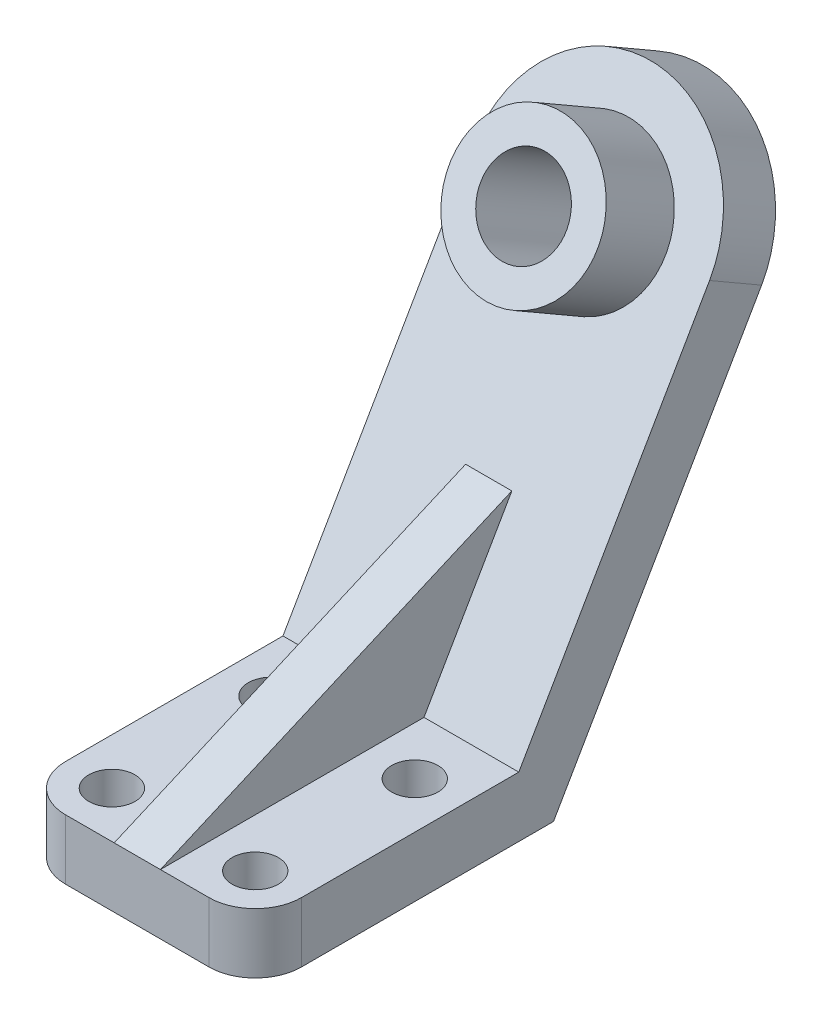
ISO-10303-21;
HEADER;
FILE_DESCRIPTION(('STEP AP214'),'2;1');
FILE_NAME('part.step','',(''),(''),'','','');
FILE_SCHEMA(('AUTOMOTIVE_DESIGN { 1 0 10303 214 1 1 1 1 }'));
ENDSEC;
DATA;
#1=APPLICATION_CONTEXT('core data for automotive mechanical design processes');
#2=APPLICATION_PROTOCOL_DEFINITION('international standard','automotive_design',2000,#1);
#3=PRODUCT_CONTEXT('',#1,'mechanical');
#4=PRODUCT('Part','Part','',(#3));
#5=PRODUCT_RELATED_PRODUCT_CATEGORY('part','',(#4));
#6=PRODUCT_DEFINITION_FORMATION('','',#4);
#7=PRODUCT_DEFINITION_CONTEXT('part definition',#1,'design');
#8=PRODUCT_DEFINITION('design','',#6,#7);
#9=PRODUCT_DEFINITION_SHAPE('','',#8);
#10=(LENGTH_UNIT() NAMED_UNIT(*) SI_UNIT(.MILLI.,.METRE.));
#11=(NAMED_UNIT(*) PLANE_ANGLE_UNIT() SI_UNIT($,.RADIAN.));
#12=(NAMED_UNIT(*) SI_UNIT($,.STERADIAN.) SOLID_ANGLE_UNIT());
#13=UNCERTAINTY_MEASURE_WITH_UNIT(LENGTH_MEASURE(1.E-05),#10,'distance_accuracy_value','');
#14=(GEOMETRIC_REPRESENTATION_CONTEXT(3) GLOBAL_UNCERTAINTY_ASSIGNED_CONTEXT((#13)) GLOBAL_UNIT_ASSIGNED_CONTEXT((#10,
#11,#12)) REPRESENTATION_CONTEXT('',''));
#15=CARTESIAN_POINT('',(0.,0.,0.));
#16=DIRECTION('',(0.,0.,1.));
#17=DIRECTION('',(1.,0.,0.));
#18=AXIS2_PLACEMENT_3D('',#15,#16,#17);
#19=CARTESIAN_POINT('',(51.,26.,0.));
#20=DIRECTION('',(0.,1.,0.));
#21=DIRECTION('',(0.,0.,1.));
#22=AXIS2_PLACEMENT_3D('',#19,#20,#21);
#23=PLANE('',#22);
#24=CARTESIAN_POINT('',(-31.0000000000002,26.,-88.9999999999996));
#25=DIRECTION('',(0.,1.,0.));
#26=DIRECTION('',(0.,0.,1.));
#27=AXIS2_PLACEMENT_3D('',#24,#25,#26);
#28=CIRCLE('',#27,10.);
#29=CARTESIAN_POINT('',(-31.0000000000002,26.,-78.9999999999996));
#30=VERTEX_POINT('',#29);
#31=EDGE_CURVE('E315',#30,#30,#28,.T.);
#32=ORIENTED_EDGE('',*,*,#31,.F.);
#33=EDGE_LOOP('',(#32));
#34=FACE_BOUND('',#33,.T.);
#35=CARTESIAN_POINT('',(-31.,26.,-19.9999999999996));
#36=DIRECTION('',(0.,1.,0.));
#37=DIRECTION('',(0.,0.,1.));
#38=AXIS2_PLACEMENT_3D('',#35,#36,#37);
#39=CIRCLE('',#38,10.);
#40=CARTESIAN_POINT('',(-31.,26.,-9.99999999999957));
#41=VERTEX_POINT('',#40);
#42=EDGE_CURVE('E323',#41,#41,#39,.T.);
#43=ORIENTED_EDGE('',*,*,#42,.F.);
#44=EDGE_LOOP('',(#43));
#45=FACE_BOUND('',#44,.T.);
#46=DIRECTION('',(0.,0.,-1.));
#47=VECTOR('',#46,1.);
#48=CARTESIAN_POINT('',(-51.,26.,0.));
#49=LINE('',#48,#47);
#50=CARTESIAN_POINT('',(-51.,26.,-20.));
#51=VERTEX_POINT('',#50);
#52=CARTESIAN_POINT('',(-51.,26.,-113.98889300107));
#53=VERTEX_POINT('',#52);
#54=EDGE_CURVE('E228',#51,#53,#49,.T.);
#55=ORIENTED_EDGE('',*,*,#54,.F.);
#56=CARTESIAN_POINT('',(-31.,26.,-20.));
#57=DIRECTION('',(0.,1.,0.));
#58=DIRECTION('',(0.,0.,1.));
#59=AXIS2_PLACEMENT_3D('',#56,#57,#58);
#60=CIRCLE('',#59,20.);
#61=CARTESIAN_POINT('',(-31.,26.,0.));
#62=VERTEX_POINT('',#61);
#63=EDGE_CURVE('E190',#51,#62,#60,.T.);
#64=ORIENTED_EDGE('',*,*,#63,.T.);
#65=DIRECTION('',(-1.,0.,0.));
#66=VECTOR('',#65,1.);
#67=CARTESIAN_POINT('',(51.,26.,0.));
#68=LINE('',#67,#66);
#69=CARTESIAN_POINT('',(-10.,26.,0.));
#70=VERTEX_POINT('',#69);
#71=EDGE_CURVE('E235',#70,#62,#68,.T.);
#72=ORIENTED_EDGE('',*,*,#71,.F.);
#73=DIRECTION('',(0.,0.,-1.));
#74=VECTOR('',#73,1.);
#75=CARTESIAN_POINT('',(-10.,26.,-113.98889300107));
#76=LINE('',#75,#74);
#77=CARTESIAN_POINT('',(-10.,26.,-113.98889300107));
#78=VERTEX_POINT('',#77);
#79=EDGE_CURVE('E293',#70,#78,#76,.T.);
#80=ORIENTED_EDGE('',*,*,#79,.T.);
#81=DIRECTION('',(-1.,0.,0.));
#82=VECTOR('',#81,1.);
#83=CARTESIAN_POINT('',(51.,26.,-113.98889300107));
#84=LINE('',#83,#82);
#85=EDGE_CURVE('E166',#78,#53,#84,.T.);
#86=ORIENTED_EDGE('',*,*,#85,.T.);
#87=EDGE_LOOP('',(#55,#64,#72,#80,#86));
#88=FACE_BOUND('',#87,.T.);
#89=ADVANCED_FACE('F58',(#34,#45,#88),#23,.T.);
#90=CARTESIAN_POINT('',(51.,-55.8586385440961,-96.7500000000003));
#91=DIRECTION('',(0.,0.499999999999998,0.86602540378444));
#92=DIRECTION('',(0.,-0.86602540378444,0.499999999999998));
#93=AXIS2_PLACEMENT_3D('',#90,#91,#92);
#94=PLANE('',#93);
#95=CARTESIAN_POINT('',(0.,155.884572680915,-218.999999999836));
#96=DIRECTION('',(0.,0.499999999999998,0.86602540378444));
#97=DIRECTION('',(0.,-0.86602540378444,0.499999999999998));
#98=AXIS2_PLACEMENT_3D('',#95,#96,#97);
#99=CIRCLE('',#98,18.5);
#100=CARTESIAN_POINT('',(0.,139.863102710903,-209.749999999836));
#101=VERTEX_POINT('',#100);
#102=EDGE_CURVE('E275',#101,#101,#99,.T.);
#103=ORIENTED_EDGE('',*,*,#102,.T.);
#104=EDGE_LOOP('',(#103));
#105=FACE_BOUND('',#104,.T.);
#106=CARTESIAN_POINT('',(0.,155.884572681199,-219.));
#107=DIRECTION('',(0.,0.499999999999998,0.86602540378444));
#108=DIRECTION('',(0.,-0.86602540378444,0.499999999999998));
#109=AXIS2_PLACEMENT_3D('',#106,#107,#108);
#110=CIRCLE('',#109,51.);
#111=CARTESIAN_POINT('',(51.,155.884572681199,-219.));
#112=VERTEX_POINT('',#111);
#113=CARTESIAN_POINT('',(-51.,155.884572681199,-219.));
#114=VERTEX_POINT('',#113);
#115=EDGE_CURVE('E256',#112,#114,#110,.T.);
#116=ORIENTED_EDGE('',*,*,#115,.F.);
#117=DIRECTION('',(0.,0.86602540378444,-0.499999999999998));
#118=VECTOR('',#117,1.);
#119=CARTESIAN_POINT('',(51.,-55.8586385440961,-96.7500000000003));
#120=LINE('',#119,#118);
#121=CARTESIAN_POINT('',(51.,0.,-129.));
#122=VERTEX_POINT('',#121);
#123=EDGE_CURVE('E227',#122,#112,#120,.T.);
#124=ORIENTED_EDGE('',*,*,#123,.F.);
#125=DIRECTION('',(-1.,0.,0.));
#126=VECTOR('',#125,1.);
#127=CARTESIAN_POINT('',(51.,0.,-129.));
#128=LINE('',#127,#126);
#129=CARTESIAN_POINT('',(-51.,0.,-129.));
#130=VERTEX_POINT('',#129);
#131=EDGE_CURVE('E243',#122,#130,#128,.T.);
#132=ORIENTED_EDGE('',*,*,#131,.T.);
#133=DIRECTION('',(0.,0.86602540378444,-0.499999999999998));
#134=VECTOR('',#133,1.);
#135=CARTESIAN_POINT('',(-51.,-55.8586385440961,-96.7500000000003));
#136=LINE('',#135,#134);
#137=EDGE_CURVE('E225',#130,#114,#136,.T.);
#138=ORIENTED_EDGE('',*,*,#137,.T.);
#139=EDGE_LOOP('',(#116,#124,#132,#138));
#140=FACE_BOUND('',#139,.T.);
#141=ADVANCED_FACE('F342',(#105,#140),#94,.F.);
#142=CARTESIAN_POINT('',(51.,-42.8586385440962,-74.2333395016049));
#143=DIRECTION('',(0.,0.499999999999998,0.86602540378444));
#144=DIRECTION('',(0.,-0.86602540378444,0.499999999999998));
#145=AXIS2_PLACEMENT_3D('',#142,#143,#144);
#146=PLANE('',#145);
#147=DIRECTION('',(0.,0.866025403784438,-0.500000000000001));
#148=VECTOR('',#147,1.);
#149=CARTESIAN_POINT('',(10.,91.8179306876173,-151.98889300107));
#150=LINE('',#149,#148);
#151=CARTESIAN_POINT('',(10.,26.,-113.98889300107));
#152=VERTEX_POINT('',#151);
#153=CARTESIAN_POINT('',(10.,91.8179306876173,-151.98889300107));
#154=VERTEX_POINT('',#153);
#155=EDGE_CURVE('E142',#152,#154,#150,.T.);
#156=ORIENTED_EDGE('',*,*,#155,.F.);
#157=CARTESIAN_POINT('',(51.,26.,-113.98889300107));
#158=VERTEX_POINT('',#157);
#159=EDGE_CURVE('E156',#158,#152,#84,.T.);
#160=ORIENTED_EDGE('',*,*,#159,.F.);
#161=DIRECTION('',(0.,0.86602540378444,-0.499999999999998));
#162=VECTOR('',#161,1.);
#163=CARTESIAN_POINT('',(51.,-42.8586385440962,-74.2333395016049));
#164=LINE('',#163,#162);
#165=CARTESIAN_POINT('',(51.,168.884572681199,-196.483339501604));
#166=VERTEX_POINT('',#165);
#167=EDGE_CURVE('E261',#158,#166,#164,.T.);
#168=ORIENTED_EDGE('',*,*,#167,.T.);
#169=CARTESIAN_POINT('',(0.,168.884572681199,-196.483339501604));
#170=DIRECTION('',(0.,0.499999999999998,0.86602540378444));
#171=DIRECTION('',(0.,-0.86602540378444,0.499999999999998));
#172=AXIS2_PLACEMENT_3D('',#169,#170,#171);
#173=CIRCLE('',#172,51.);
#174=CARTESIAN_POINT('',(-51.,168.884572681199,-196.483339501604));
#175=VERTEX_POINT('',#174);
#176=EDGE_CURVE('E185',#166,#175,#173,.T.);
#177=ORIENTED_EDGE('',*,*,#176,.T.);
#178=DIRECTION('',(0.,0.86602540378444,-0.499999999999998));
#179=VECTOR('',#178,1.);
#180=CARTESIAN_POINT('',(-51.,-42.8586385440962,-74.2333395016049));
#181=LINE('',#180,#179);
#182=EDGE_CURVE('E250',#53,#175,#181,.T.);
#183=ORIENTED_EDGE('',*,*,#182,.F.);
#184=ORIENTED_EDGE('',*,*,#85,.F.);
#185=DIRECTION('',(0.,0.866025403784438,-0.500000000000001));
#186=VECTOR('',#185,1.);
#187=CARTESIAN_POINT('',(-10.,91.8179306876173,-151.98889300107));
#188=LINE('',#187,#186);
#189=CARTESIAN_POINT('',(-10.,91.8179306876173,-151.98889300107));
#190=VERTEX_POINT('',#189);
#191=EDGE_CURVE('E290',#78,#190,#188,.T.);
#192=ORIENTED_EDGE('',*,*,#191,.T.);
#193=DIRECTION('',(-1.,0.,0.));
#194=VECTOR('',#193,1.);
#195=CARTESIAN_POINT('',(10.,91.8179306876173,-151.98889300107));
#196=LINE('',#195,#194);
#197=EDGE_CURVE('E159',#154,#190,#196,.T.);
#198=ORIENTED_EDGE('',*,*,#197,.F.);
#199=EDGE_LOOP('',(#156,#160,#168,#177,#183,#184,#192,#198));
#200=FACE_BOUND('',#199,.T.);
#201=CARTESIAN_POINT('',(0.,168.884572680915,-196.48333950144));
#202=DIRECTION('',(0.,0.499999999999998,0.86602540378444));
#203=DIRECTION('',(0.,-0.86602540378444,0.499999999999998));
#204=AXIS2_PLACEMENT_3D('',#201,#202,#203);
#205=CIRCLE('',#204,32.);
#206=CARTESIAN_POINT('',(0.,141.171759759813,-180.48333950144));
#207=VERTEX_POINT('',#206);
#208=EDGE_CURVE('E181',#207,#207,#205,.F.);
#209=ORIENTED_EDGE('',*,*,#208,.T.);
#210=EDGE_LOOP('',(#209));
#211=FACE_BOUND('',#210,.T.);
#212=ADVANCED_FACE('F153',(#200,#211),#146,.T.);
#213=CARTESIAN_POINT('',(51.,0.,0.));
#214=DIRECTION('',(1.,0.,0.));
#215=DIRECTION('',(0.,0.,-1.));
#216=AXIS2_PLACEMENT_3D('',#213,#214,#215);
#217=PLANE('',#216);
#218=DIRECTION('',(0.,0.,-1.));
#219=VECTOR('',#218,1.);
#220=CARTESIAN_POINT('',(51.,26.,0.));
#221=LINE('',#220,#219);
#222=CARTESIAN_POINT('',(51.,26.,-20.));
#223=VERTEX_POINT('',#222);
#224=EDGE_CURVE('E163',#223,#158,#221,.T.);
#225=ORIENTED_EDGE('',*,*,#224,.F.);
#226=DIRECTION('',(0.,1.,0.));
#227=VECTOR('',#226,1.);
#228=CARTESIAN_POINT('',(51.,0.,-20.));
#229=LINE('',#228,#227);
#230=CARTESIAN_POINT('',(51.,0.,-20.));
#231=VERTEX_POINT('',#230);
#232=EDGE_CURVE('E12',#223,#231,#229,.F.);
#233=ORIENTED_EDGE('',*,*,#232,.T.);
#234=DIRECTION('',(0.,0.,-1.));
#235=VECTOR('',#234,1.);
#236=CARTESIAN_POINT('',(51.,0.,0.));
#237=LINE('',#236,#235);
#238=EDGE_CURVE('E245',#231,#122,#237,.T.);
#239=ORIENTED_EDGE('',*,*,#238,.T.);
#240=ORIENTED_EDGE('',*,*,#123,.T.);
#241=DIRECTION('',(0.,0.499999999999998,0.86602540378444));
#242=VECTOR('',#241,1.);
#243=CARTESIAN_POINT('',(51.,117.884572681199,-284.817930687617));
#244=LINE('',#243,#242);
#245=EDGE_CURVE('E170',#112,#166,#244,.T.);
#246=ORIENTED_EDGE('',*,*,#245,.T.);
#247=ORIENTED_EDGE('',*,*,#167,.F.);
#248=EDGE_LOOP('',(#225,#233,#239,#240,#246,#247));
#249=FACE_BOUND('',#248,.T.);
#250=ADVANCED_FACE('F361',(#249),#217,.T.);
#251=CARTESIAN_POINT('',(-51.,0.,0.));
#252=DIRECTION('',(1.,0.,0.));
#253=DIRECTION('',(0.,0.,-1.));
#254=AXIS2_PLACEMENT_3D('',#251,#252,#253);
#255=PLANE('',#254);
#256=DIRECTION('',(0.,0.,-1.));
#257=VECTOR('',#256,1.);
#258=CARTESIAN_POINT('',(-51.,0.,0.));
#259=LINE('',#258,#257);
#260=CARTESIAN_POINT('',(-51.,0.,-20.));
#261=VERTEX_POINT('',#260);
#262=EDGE_CURVE('E212',#261,#130,#259,.T.);
#263=ORIENTED_EDGE('',*,*,#262,.F.);
#264=DIRECTION('',(0.,1.,0.));
#265=VECTOR('',#264,1.);
#266=CARTESIAN_POINT('',(-51.,26.,-20.));
#267=LINE('',#266,#265);
#268=EDGE_CURVE('E180',#261,#51,#267,.T.);
#269=ORIENTED_EDGE('',*,*,#268,.T.);
#270=ORIENTED_EDGE('',*,*,#54,.T.);
#271=ORIENTED_EDGE('',*,*,#182,.T.);
#272=DIRECTION('',(0.,0.499999999999998,0.86602540378444));
#273=VECTOR('',#272,1.);
#274=CARTESIAN_POINT('',(-51.,117.884572681199,-284.817930687617));
#275=LINE('',#274,#273);
#276=EDGE_CURVE('E165',#114,#175,#275,.T.);
#277=ORIENTED_EDGE('',*,*,#276,.F.);
#278=ORIENTED_EDGE('',*,*,#137,.F.);
#279=EDGE_LOOP('',(#263,#269,#270,#271,#277,#278));
#280=FACE_BOUND('',#279,.T.);
#281=ADVANCED_FACE('F221',(#280),#255,.F.);
#282=CARTESIAN_POINT('',(30.9999999999998,26.,-89.));
#283=DIRECTION('',(0.,1.,0.));
#284=DIRECTION('',(0.,0.,1.));
#285=AXIS2_PLACEMENT_3D('',#282,#283,#284);
#286=CIRCLE('',#285,9.99999999999999);
#287=CARTESIAN_POINT('',(30.9999999999998,26.,-79.));
#288=VERTEX_POINT('',#287);
#289=EDGE_CURVE('E307',#288,#288,#286,.T.);
#290=ORIENTED_EDGE('',*,*,#289,.F.);
#291=EDGE_LOOP('',(#290));
#292=FACE_BOUND('',#291,.T.);
#293=CARTESIAN_POINT('',(31.,26.,-19.9999999999997));
#294=DIRECTION('',(0.,1.,0.));
#295=DIRECTION('',(0.,0.,1.));
#296=AXIS2_PLACEMENT_3D('',#293,#294,#295);
#297=CIRCLE('',#296,10.0000000000001);
#298=CARTESIAN_POINT('',(31.,26.,-9.99999999999963));
#299=VERTEX_POINT('',#298);
#300=EDGE_CURVE('E299',#299,#299,#297,.T.);
#301=ORIENTED_EDGE('',*,*,#300,.F.);
#302=EDGE_LOOP('',(#301));
#303=FACE_BOUND('',#302,.T.);
#304=CARTESIAN_POINT('',(31.,26.,0.));
#305=VERTEX_POINT('',#304);
#306=CARTESIAN_POINT('',(10.,26.,0.));
#307=VERTEX_POINT('',#306);
#308=EDGE_CURVE('E173',#305,#307,#68,.T.);
#309=ORIENTED_EDGE('',*,*,#308,.F.);
#310=CARTESIAN_POINT('',(31.,26.,-20.));
#311=DIRECTION('',(0.,1.,0.));
#312=DIRECTION('',(0.,0.,1.));
#313=AXIS2_PLACEMENT_3D('',#310,#311,#312);
#314=CIRCLE('',#313,20.);
#315=EDGE_CURVE('E67',#305,#223,#314,.T.);
#316=ORIENTED_EDGE('',*,*,#315,.T.);
#317=ORIENTED_EDGE('',*,*,#224,.T.);
#318=ORIENTED_EDGE('',*,*,#159,.T.);
#319=DIRECTION('',(0.,0.,-1.));
#320=VECTOR('',#319,1.);
#321=CARTESIAN_POINT('',(10.,26.,-113.98889300107));
#322=LINE('',#321,#320);
#323=EDGE_CURVE('E139',#307,#152,#322,.T.);
#324=ORIENTED_EDGE('',*,*,#323,.F.);
#325=EDGE_LOOP('',(#309,#316,#317,#318,#324));
#326=FACE_BOUND('',#325,.T.);
#327=ADVANCED_FACE('F162',(#292,#303,#326),#23,.T.);
#328=CARTESIAN_POINT('',(51.,0.,0.));
#329=DIRECTION('',(0.,0.,1.));
#330=DIRECTION('',(1.,0.,0.));
#331=AXIS2_PLACEMENT_3D('',#328,#329,#330);
#332=PLANE('',#331);
#333=ORIENTED_EDGE('',*,*,#71,.T.);
#334=DIRECTION('',(0.,1.,0.));
#335=VECTOR('',#334,1.);
#336=CARTESIAN_POINT('',(-31.,0.,0.));
#337=LINE('',#336,#335);
#338=CARTESIAN_POINT('',(-31.,0.,0.));
#339=VERTEX_POINT('',#338);
#340=EDGE_CURVE('E197',#62,#339,#337,.F.);
#341=ORIENTED_EDGE('',*,*,#340,.T.);
#342=DIRECTION('',(-1.,0.,0.));
#343=VECTOR('',#342,1.);
#344=CARTESIAN_POINT('',(51.,0.,0.));
#345=LINE('',#344,#343);
#346=CARTESIAN_POINT('',(31.,0.,0.));
#347=VERTEX_POINT('',#346);
#348=EDGE_CURVE('E215',#347,#339,#345,.T.);
#349=ORIENTED_EDGE('',*,*,#348,.F.);
#350=DIRECTION('',(0.,1.,0.));
#351=VECTOR('',#350,1.);
#352=CARTESIAN_POINT('',(31.,0.,0.));
#353=LINE('',#352,#351);
#354=EDGE_CURVE('E193',#347,#305,#353,.T.);
#355=ORIENTED_EDGE('',*,*,#354,.T.);
#356=ORIENTED_EDGE('',*,*,#308,.T.);
#357=DIRECTION('',(-1.,0.,0.));
#358=VECTOR('',#357,1.);
#359=CARTESIAN_POINT('',(10.,26.,0.));
#360=LINE('',#359,#358);
#361=EDGE_CURVE('E239',#307,#70,#360,.T.);
#362=ORIENTED_EDGE('',*,*,#361,.T.);
#363=EDGE_LOOP('',(#333,#341,#349,#355,#356,#362));
#364=FACE_BOUND('',#363,.T.);
#365=ADVANCED_FACE('F238',(#364),#332,.T.);
#366=CARTESIAN_POINT('',(51.,0.,0.));
#367=DIRECTION('',(0.,1.,0.));
#368=DIRECTION('',(0.,0.,1.));
#369=AXIS2_PLACEMENT_3D('',#366,#367,#368);
#370=PLANE('',#369);
#371=CARTESIAN_POINT('',(30.9999999999998,0.,-89.));
#372=DIRECTION('',(0.,1.,0.));
#373=DIRECTION('',(0.,0.,1.));
#374=AXIS2_PLACEMENT_3D('',#371,#372,#373);
#375=CIRCLE('',#374,9.99999999999999);
#376=CARTESIAN_POINT('',(30.9999999999998,0.,-79.));
#377=VERTEX_POINT('',#376);
#378=EDGE_CURVE('E311',#377,#377,#375,.T.);
#379=ORIENTED_EDGE('',*,*,#378,.T.);
#380=EDGE_LOOP('',(#379));
#381=FACE_BOUND('',#380,.T.);
#382=CARTESIAN_POINT('',(-31.0000000000002,0.,-88.9999999999996));
#383=DIRECTION('',(0.,1.,0.));
#384=DIRECTION('',(0.,0.,1.));
#385=AXIS2_PLACEMENT_3D('',#382,#383,#384);
#386=CIRCLE('',#385,10.);
#387=CARTESIAN_POINT('',(-31.0000000000002,0.,-78.9999999999996));
#388=VERTEX_POINT('',#387);
#389=EDGE_CURVE('E319',#388,#388,#386,.T.);
#390=ORIENTED_EDGE('',*,*,#389,.T.);
#391=EDGE_LOOP('',(#390));
#392=FACE_BOUND('',#391,.T.);
#393=CARTESIAN_POINT('',(-31.,0.,-19.9999999999996));
#394=DIRECTION('',(0.,1.,0.));
#395=DIRECTION('',(0.,0.,1.));
#396=AXIS2_PLACEMENT_3D('',#393,#394,#395);
#397=CIRCLE('',#396,10.);
#398=CARTESIAN_POINT('',(-31.,0.,-9.99999999999957));
#399=VERTEX_POINT('',#398);
#400=EDGE_CURVE('E303',#399,#399,#397,.T.);
#401=ORIENTED_EDGE('',*,*,#400,.T.);
#402=EDGE_LOOP('',(#401));
#403=FACE_BOUND('',#402,.T.);
#404=CARTESIAN_POINT('',(31.,0.,-19.9999999999997));
#405=DIRECTION('',(0.,1.,0.));
#406=DIRECTION('',(0.,0.,1.));
#407=AXIS2_PLACEMENT_3D('',#404,#405,#406);
#408=CIRCLE('',#407,10.0000000000001);
#409=CARTESIAN_POINT('',(31.,0.,-9.99999999999963));
#410=VERTEX_POINT('',#409);
#411=EDGE_CURVE('E296',#410,#410,#408,.T.);
#412=ORIENTED_EDGE('',*,*,#411,.T.);
#413=EDGE_LOOP('',(#412));
#414=FACE_BOUND('',#413,.T.);
#415=ORIENTED_EDGE('',*,*,#348,.T.);
#416=CARTESIAN_POINT('',(-31.,0.,-20.));
#417=DIRECTION('',(0.,1.,0.));
#418=DIRECTION('',(0.,0.,1.));
#419=AXIS2_PLACEMENT_3D('',#416,#417,#418);
#420=CIRCLE('',#419,20.);
#421=EDGE_CURVE('E203',#339,#261,#420,.F.);
#422=ORIENTED_EDGE('',*,*,#421,.T.);
#423=ORIENTED_EDGE('',*,*,#262,.T.);
#424=ORIENTED_EDGE('',*,*,#131,.F.);
#425=ORIENTED_EDGE('',*,*,#238,.F.);
#426=CARTESIAN_POINT('',(31.,0.,-20.));
#427=DIRECTION('',(0.,1.,0.));
#428=DIRECTION('',(0.,0.,1.));
#429=AXIS2_PLACEMENT_3D('',#426,#427,#428);
#430=CIRCLE('',#429,20.);
#431=EDGE_CURVE('E200',#231,#347,#430,.F.);
#432=ORIENTED_EDGE('',*,*,#431,.T.);
#433=EDGE_LOOP('',(#415,#422,#423,#424,#425,#432));
#434=FACE_BOUND('',#433,.T.);
#435=ADVANCED_FACE('F210',(#381,#392,#403,#414,#434),#370,.F.);
#436=CARTESIAN_POINT('',(0.,117.884572681199,-284.817930687617));
#437=DIRECTION('',(0.,0.499999999999998,0.86602540378444));
#438=DIRECTION('',(0.,-0.86602540378444,0.499999999999998));
#439=AXIS2_PLACEMENT_3D('',#436,#437,#438);
#440=CYLINDRICAL_SURFACE('',#439,51.);
#441=ORIENTED_EDGE('',*,*,#115,.T.);
#442=ORIENTED_EDGE('',*,*,#276,.T.);
#443=ORIENTED_EDGE('',*,*,#176,.F.);
#444=ORIENTED_EDGE('',*,*,#245,.F.);
#445=EDGE_LOOP('',(#441,#442,#443,#444));
#446=FACE_BOUND('',#445,.T.);
#447=ADVANCED_FACE('F398',(#446),#440,.T.);
#448=CARTESIAN_POINT('',(0.,185.884572681316,-167.038475772075));
#449=DIRECTION('',(0.,-0.499999999999998,-0.86602540378444));
#450=DIRECTION('',(0.,0.86602540378444,-0.499999999999998));
#451=AXIS2_PLACEMENT_3D('',#448,#449,#450);
#452=CYLINDRICAL_SURFACE('',#451,32.);
#453=ORIENTED_EDGE('',*,*,#208,.F.);
#454=EDGE_LOOP('',(#453));
#455=FACE_BOUND('',#454,.T.);
#456=CARTESIAN_POINT('',(0.,185.884572681316,-167.038475772075));
#457=DIRECTION('',(0.,0.499999999999998,0.86602540378444));
#458=DIRECTION('',(0.,-0.86602540378444,0.499999999999998));
#459=AXIS2_PLACEMENT_3D('',#456,#457,#458);
#460=CIRCLE('',#459,32.);
#461=CARTESIAN_POINT('',(0.,158.171759760214,-151.038475772075));
#462=VERTEX_POINT('',#461);
#463=EDGE_CURVE('E186',#462,#462,#460,.T.);
#464=ORIENTED_EDGE('',*,*,#463,.F.);
#465=EDGE_LOOP('',(#464));
#466=FACE_BOUND('',#465,.T.);
#467=ADVANCED_FACE('F394',(#455,#466),#452,.T.);
#468=CARTESIAN_POINT('',(0.,185.884572681316,-167.038475772075));
#469=DIRECTION('',(0.,0.499999999999998,0.86602540378444));
#470=DIRECTION('',(0.,-0.86602540378444,0.499999999999998));
#471=AXIS2_PLACEMENT_3D('',#468,#469,#470);
#472=PLANE('',#471);
#473=CARTESIAN_POINT('',(0.,185.884572681316,-167.038475772075));
#474=DIRECTION('',(0.,0.499999999999998,0.86602540378444));
#475=DIRECTION('',(0.,-0.86602540378444,0.499999999999998));
#476=AXIS2_PLACEMENT_3D('',#473,#474,#475);
#477=CIRCLE('',#476,18.5);
#478=CARTESIAN_POINT('',(0.,169.863102711304,-157.788475772075));
#479=VERTEX_POINT('',#478);
#480=EDGE_CURVE('E279',#479,#479,#477,.T.);
#481=ORIENTED_EDGE('',*,*,#480,.F.);
#482=EDGE_LOOP('',(#481));
#483=FACE_BOUND('',#482,.T.);
#484=ORIENTED_EDGE('',*,*,#463,.T.);
#485=EDGE_LOOP('',(#484));
#486=FACE_BOUND('',#485,.T.);
#487=ADVANCED_FACE('F390',(#483,#486),#472,.T.);
#488=CARTESIAN_POINT('',(0.,105.871605612364,-305.624999999836));
#489=DIRECTION('',(0.,0.499999999999998,0.86602540378444));
#490=DIRECTION('',(0.,-0.86602540378444,0.499999999999998));
#491=AXIS2_PLACEMENT_3D('',#488,#489,#490);
#492=CYLINDRICAL_SURFACE('',#491,18.5);
#493=ORIENTED_EDGE('',*,*,#480,.T.);
#494=EDGE_LOOP('',(#493));
#495=FACE_BOUND('',#494,.T.);
#496=ORIENTED_EDGE('',*,*,#102,.F.);
#497=EDGE_LOOP('',(#496));
#498=FACE_BOUND('',#497,.T.);
#499=ADVANCED_FACE('F386',(#495,#498),#492,.F.);
#500=CARTESIAN_POINT('',(10.,26.,0.));
#501=DIRECTION('',(0.,-0.917652346747377,-0.397384159861755));
#502=DIRECTION('',(0.,0.397384159861755,-0.917652346747377));
#503=AXIS2_PLACEMENT_3D('',#500,#501,#502);
#504=PLANE('',#503);
#505=DIRECTION('',(0.,-0.397384159861754,0.917652346747377));
#506=VECTOR('',#505,1.);
#507=CARTESIAN_POINT('',(-10.,26.,0.));
#508=LINE('',#507,#506);
#509=EDGE_CURVE('E148',#190,#70,#508,.T.);
#510=ORIENTED_EDGE('',*,*,#509,.T.);
#511=ORIENTED_EDGE('',*,*,#361,.F.);
#512=DIRECTION('',(0.,-0.397384159861754,0.917652346747377));
#513=VECTOR('',#512,1.);
#514=CARTESIAN_POINT('',(10.,26.,0.));
#515=LINE('',#514,#513);
#516=EDGE_CURVE('E144',#154,#307,#515,.T.);
#517=ORIENTED_EDGE('',*,*,#516,.F.);
#518=ORIENTED_EDGE('',*,*,#197,.T.);
#519=EDGE_LOOP('',(#510,#511,#517,#518));
#520=FACE_BOUND('',#519,.T.);
#521=ADVANCED_FACE('F382',(#520),#504,.F.);
#522=CARTESIAN_POINT('',(10.,0.,0.));
#523=DIRECTION('',(1.,0.,0.));
#524=DIRECTION('',(0.,0.,-1.));
#525=AXIS2_PLACEMENT_3D('',#522,#523,#524);
#526=PLANE('',#525);
#527=ORIENTED_EDGE('',*,*,#323,.T.);
#528=ORIENTED_EDGE('',*,*,#155,.T.);
#529=ORIENTED_EDGE('',*,*,#516,.T.);
#530=EDGE_LOOP('',(#527,#528,#529));
#531=FACE_BOUND('',#530,.T.);
#532=ADVANCED_FACE('F141',(#531),#526,.T.);
#533=CARTESIAN_POINT('',(-10.,0.,0.));
#534=DIRECTION('',(1.,0.,0.));
#535=DIRECTION('',(0.,0.,-1.));
#536=AXIS2_PLACEMENT_3D('',#533,#534,#535);
#537=PLANE('',#536);
#538=ORIENTED_EDGE('',*,*,#79,.F.);
#539=ORIENTED_EDGE('',*,*,#509,.F.);
#540=ORIENTED_EDGE('',*,*,#191,.F.);
#541=EDGE_LOOP('',(#538,#539,#540));
#542=FACE_BOUND('',#541,.T.);
#543=ADVANCED_FACE('F368',(#542),#537,.F.);
#544=CARTESIAN_POINT('',(31.,0.,-19.9999999999997));
#545=DIRECTION('',(0.,1.,0.));
#546=DIRECTION('',(0.,0.,1.));
#547=AXIS2_PLACEMENT_3D('',#544,#545,#546);
#548=CYLINDRICAL_SURFACE('',#547,10.0000000000001);
#549=CARTESIAN_POINT('',(31.,0.,-9.99999999999963));
#550=CARTESIAN_POINT('',(31.,0.270833333333333,-9.99999999999963));
#551=CARTESIAN_POINT('',(31.,0.541666666666667,-9.99999999999963));
#552=CARTESIAN_POINT('',(31.,1.08333333333333,-9.99999999999963));
#553=CARTESIAN_POINT('',(31.,1.35416666666667,-9.99999999999963));
#554=CARTESIAN_POINT('',(31.,1.89583333333333,-9.99999999999963));
#555=CARTESIAN_POINT('',(31.,2.16666666666667,-9.99999999999963));
#556=CARTESIAN_POINT('',(31.,2.70833333333333,-9.99999999999963));
#557=CARTESIAN_POINT('',(31.,2.97916666666667,-9.99999999999963));
#558=CARTESIAN_POINT('',(31.,3.52083333333333,-9.99999999999963));
#559=CARTESIAN_POINT('',(31.,3.79166666666667,-9.99999999999963));
#560=CARTESIAN_POINT('',(31.,4.33333333333333,-9.99999999999963));
#561=CARTESIAN_POINT('',(31.,4.60416666666667,-9.99999999999963));
#562=CARTESIAN_POINT('',(31.,5.14583333333333,-9.99999999999963));
#563=CARTESIAN_POINT('',(31.,5.41666666666667,-9.99999999999963));
#564=CARTESIAN_POINT('',(31.,5.95833333333333,-9.99999999999963));
#565=CARTESIAN_POINT('',(31.,6.22916666666667,-9.99999999999963));
#566=CARTESIAN_POINT('',(31.,6.77083333333333,-9.99999999999963));
#567=CARTESIAN_POINT('',(31.,7.04166666666667,-9.99999999999963));
#568=CARTESIAN_POINT('',(31.,7.58333333333333,-9.99999999999963));
#569=CARTESIAN_POINT('',(31.,7.85416666666667,-9.99999999999963));
#570=CARTESIAN_POINT('',(31.,8.39583333333333,-9.99999999999963));
#571=CARTESIAN_POINT('',(31.,8.66666666666667,-9.99999999999963));
#572=CARTESIAN_POINT('',(31.,9.20833333333333,-9.99999999999963));
#573=CARTESIAN_POINT('',(31.,9.47916666666667,-9.99999999999963));
#574=CARTESIAN_POINT('',(31.,10.0208333333333,-9.99999999999963));
#575=CARTESIAN_POINT('',(31.,10.2916666666667,-9.99999999999963));
#576=CARTESIAN_POINT('',(31.,10.8333333333333,-9.99999999999963));
#577=CARTESIAN_POINT('',(31.,11.1041666666667,-9.99999999999963));
#578=CARTESIAN_POINT('',(31.,11.6458333333333,-9.99999999999963));
#579=CARTESIAN_POINT('',(31.,11.9166666666667,-9.99999999999963));
#580=CARTESIAN_POINT('',(31.,12.4583333333333,-9.99999999999963));
#581=CARTESIAN_POINT('',(31.,12.7291666666667,-9.99999999999963));
#582=CARTESIAN_POINT('',(31.,13.2708333333333,-9.99999999999963));
#583=CARTESIAN_POINT('',(31.,13.5416666666667,-9.99999999999963));
#584=CARTESIAN_POINT('',(31.,14.0833333333333,-9.99999999999963));
#585=CARTESIAN_POINT('',(31.,14.3541666666667,-9.99999999999963));
#586=CARTESIAN_POINT('',(31.,14.8958333333333,-9.99999999999963));
#587=CARTESIAN_POINT('',(31.,15.1666666666667,-9.99999999999963));
#588=CARTESIAN_POINT('',(31.,15.7083333333333,-9.99999999999963));
#589=CARTESIAN_POINT('',(31.,15.9791666666667,-9.99999999999963));
#590=CARTESIAN_POINT('',(31.,16.5208333333333,-9.99999999999963));
#591=CARTESIAN_POINT('',(31.,16.7916666666667,-9.99999999999963));
#592=CARTESIAN_POINT('',(31.,17.3333333333333,-9.99999999999963));
#593=CARTESIAN_POINT('',(31.,17.6041666666667,-9.99999999999963));
#594=CARTESIAN_POINT('',(31.,18.1458333333333,-9.99999999999963));
#595=CARTESIAN_POINT('',(31.,18.4166666666667,-9.99999999999963));
#596=CARTESIAN_POINT('',(31.,18.9583333333333,-9.99999999999963));
#597=CARTESIAN_POINT('',(31.,19.2291666666667,-9.99999999999963));
#598=CARTESIAN_POINT('',(31.,19.7708333333333,-9.99999999999963));
#599=CARTESIAN_POINT('',(31.,20.0416666666667,-9.99999999999963));
#600=CARTESIAN_POINT('',(31.,20.5833333333333,-9.99999999999963));
#601=CARTESIAN_POINT('',(31.,20.8541666666667,-9.99999999999963));
#602=CARTESIAN_POINT('',(31.,21.3958333333333,-9.99999999999963));
#603=CARTESIAN_POINT('',(31.,21.6666666666667,-9.99999999999963));
#604=CARTESIAN_POINT('',(31.,22.2083333333333,-9.99999999999963));
#605=CARTESIAN_POINT('',(31.,22.4791666666667,-9.99999999999963));
#606=CARTESIAN_POINT('',(31.,23.0208333333333,-9.99999999999963));
#607=CARTESIAN_POINT('',(31.,23.2916666666667,-9.99999999999963));
#608=CARTESIAN_POINT('',(31.,23.8333333333333,-9.99999999999963));
#609=CARTESIAN_POINT('',(31.,24.1041666666667,-9.99999999999963));
#610=CARTESIAN_POINT('',(31.,24.6458333333333,-9.99999999999963));
#611=CARTESIAN_POINT('',(31.,24.9166666666667,-9.99999999999963));
#612=CARTESIAN_POINT('',(31.,25.4583333333333,-9.99999999999963));
#613=CARTESIAN_POINT('',(31.,25.7291666666667,-9.99999999999963));
#614=CARTESIAN_POINT('',(31.,26.,-9.99999999999963));
#615=B_SPLINE_CURVE_WITH_KNOTS('',3,(#549,#550,#551,#552,#553,#554,#555,#556,#557,#558,#559,
#560,#561,#562,#563,#564,#565,#566,#567,#568,#569,#570,#571,#572,#573,#574,#575,#576,#577,#578,
#579,#580,#581,#582,#583,#584,#585,#586,#587,#588,#589,#590,#591,#592,#593,#594,#595,#596,#597,
#598,#599,#600,#601,#602,#603,#604,#605,#606,#607,#608,#609,#610,#611,#612,#613,#614),
.UNSPECIFIED.,.F.,.F.,(4,2,2,2,2,2,2,2,2,2,2,2,2,2,2,2,2,2,2,2,2,2,2,2,2,2,2,2,2,2,2,2,4),(0.,
0.8125,1.625,2.4375,3.25,4.0625,4.875,5.6875,6.5,7.3125,8.125,8.9375,9.75,10.5625,11.375,
12.1875,13.,13.8125,14.625,15.4375,16.25,17.0625,17.875,18.6875,19.5,20.3125,21.125,21.9375,
22.75,23.5625,24.375,25.1875,26.),.UNSPECIFIED.);
#616=EDGE_CURVE('BSEAM337',#410,#299,#615,.T.);
#617=ORIENTED_EDGE('',*,*,#411,.F.);
#618=ORIENTED_EDGE('',*,*,#300,.T.);
#619=ORIENTED_EDGE('',*,*,#616,.T.);
#620=ORIENTED_EDGE('',*,*,#616,.F.);
#621=EDGE_LOOP('',(#617,#619,#618,#620));
#622=FACE_BOUND('',#621,.T.);
#623=ADVANCED_FACE('F337',(#622),#548,.F.);
#624=CARTESIAN_POINT('',(-31.,0.,-19.9999999999996));
#625=DIRECTION('',(0.,1.,0.));
#626=DIRECTION('',(0.,0.,1.));
#627=AXIS2_PLACEMENT_3D('',#624,#625,#626);
#628=CYLINDRICAL_SURFACE('',#627,10.);
#629=CARTESIAN_POINT('',(-31.,0.,-9.99999999999957));
#630=CARTESIAN_POINT('',(-31.,0.270833333333333,-9.99999999999957));
#631=CARTESIAN_POINT('',(-31.,0.541666666666667,-9.99999999999957));
#632=CARTESIAN_POINT('',(-31.,1.08333333333333,-9.99999999999957));
#633=CARTESIAN_POINT('',(-31.,1.35416666666667,-9.99999999999957));
#634=CARTESIAN_POINT('',(-31.,1.89583333333333,-9.99999999999957));
#635=CARTESIAN_POINT('',(-31.,2.16666666666667,-9.99999999999957));
#636=CARTESIAN_POINT('',(-31.,2.70833333333333,-9.99999999999957));
#637=CARTESIAN_POINT('',(-31.,2.97916666666667,-9.99999999999957));
#638=CARTESIAN_POINT('',(-31.,3.52083333333333,-9.99999999999957));
#639=CARTESIAN_POINT('',(-31.,3.79166666666667,-9.99999999999957));
#640=CARTESIAN_POINT('',(-31.,4.33333333333333,-9.99999999999957));
#641=CARTESIAN_POINT('',(-31.,4.60416666666667,-9.99999999999957));
#642=CARTESIAN_POINT('',(-31.,5.14583333333333,-9.99999999999957));
#643=CARTESIAN_POINT('',(-31.,5.41666666666667,-9.99999999999957));
#644=CARTESIAN_POINT('',(-31.,5.95833333333333,-9.99999999999957));
#645=CARTESIAN_POINT('',(-31.,6.22916666666667,-9.99999999999957));
#646=CARTESIAN_POINT('',(-31.,6.77083333333333,-9.99999999999957));
#647=CARTESIAN_POINT('',(-31.,7.04166666666667,-9.99999999999957));
#648=CARTESIAN_POINT('',(-31.,7.58333333333333,-9.99999999999957));
#649=CARTESIAN_POINT('',(-31.,7.85416666666667,-9.99999999999957));
#650=CARTESIAN_POINT('',(-31.,8.39583333333333,-9.99999999999957));
#651=CARTESIAN_POINT('',(-31.,8.66666666666667,-9.99999999999957));
#652=CARTESIAN_POINT('',(-31.,9.20833333333333,-9.99999999999957));
#653=CARTESIAN_POINT('',(-31.,9.47916666666667,-9.99999999999957));
#654=CARTESIAN_POINT('',(-31.,10.0208333333333,-9.99999999999957));
#655=CARTESIAN_POINT('',(-31.,10.2916666666667,-9.99999999999957));
#656=CARTESIAN_POINT('',(-31.,10.8333333333333,-9.99999999999957));
#657=CARTESIAN_POINT('',(-31.,11.1041666666667,-9.99999999999957));
#658=CARTESIAN_POINT('',(-31.,11.6458333333333,-9.99999999999957));
#659=CARTESIAN_POINT('',(-31.,11.9166666666667,-9.99999999999957));
#660=CARTESIAN_POINT('',(-31.,12.4583333333333,-9.99999999999957));
#661=CARTESIAN_POINT('',(-31.,12.7291666666667,-9.99999999999957));
#662=CARTESIAN_POINT('',(-31.,13.2708333333333,-9.99999999999957));
#663=CARTESIAN_POINT('',(-31.,13.5416666666667,-9.99999999999957));
#664=CARTESIAN_POINT('',(-31.,14.0833333333333,-9.99999999999957));
#665=CARTESIAN_POINT('',(-31.,14.3541666666667,-9.99999999999957));
#666=CARTESIAN_POINT('',(-31.,14.8958333333333,-9.99999999999957));
#667=CARTESIAN_POINT('',(-31.,15.1666666666667,-9.99999999999957));
#668=CARTESIAN_POINT('',(-31.,15.7083333333333,-9.99999999999957));
#669=CARTESIAN_POINT('',(-31.,15.9791666666667,-9.99999999999957));
#670=CARTESIAN_POINT('',(-31.,16.5208333333333,-9.99999999999957));
#671=CARTESIAN_POINT('',(-31.,16.7916666666667,-9.99999999999957));
#672=CARTESIAN_POINT('',(-31.,17.3333333333333,-9.99999999999957));
#673=CARTESIAN_POINT('',(-31.,17.6041666666667,-9.99999999999957));
#674=CARTESIAN_POINT('',(-31.,18.1458333333333,-9.99999999999957));
#675=CARTESIAN_POINT('',(-31.,18.4166666666667,-9.99999999999957));
#676=CARTESIAN_POINT('',(-31.,18.9583333333333,-9.99999999999957));
#677=CARTESIAN_POINT('',(-31.,19.2291666666667,-9.99999999999957));
#678=CARTESIAN_POINT('',(-31.,19.7708333333333,-9.99999999999957));
#679=CARTESIAN_POINT('',(-31.,20.0416666666667,-9.99999999999957));
#680=CARTESIAN_POINT('',(-31.,20.5833333333333,-9.99999999999957));
#681=CARTESIAN_POINT('',(-31.,20.8541666666667,-9.99999999999957));
#682=CARTESIAN_POINT('',(-31.,21.3958333333333,-9.99999999999957));
#683=CARTESIAN_POINT('',(-31.,21.6666666666667,-9.99999999999957));
#684=CARTESIAN_POINT('',(-31.,22.2083333333333,-9.99999999999957));
#685=CARTESIAN_POINT('',(-31.,22.4791666666667,-9.99999999999957));
#686=CARTESIAN_POINT('',(-31.,23.0208333333333,-9.99999999999957));
#687=CARTESIAN_POINT('',(-31.,23.2916666666667,-9.99999999999957));
#688=CARTESIAN_POINT('',(-31.,23.8333333333333,-9.99999999999957));
#689=CARTESIAN_POINT('',(-31.,24.1041666666667,-9.99999999999957));
#690=CARTESIAN_POINT('',(-31.,24.6458333333333,-9.99999999999957));
#691=CARTESIAN_POINT('',(-31.,24.9166666666667,-9.99999999999957));
#692=CARTESIAN_POINT('',(-31.,25.4583333333333,-9.99999999999957));
#693=CARTESIAN_POINT('',(-31.,25.7291666666667,-9.99999999999957));
#694=CARTESIAN_POINT('',(-31.,26.,-9.99999999999957));
#695=B_SPLINE_CURVE_WITH_KNOTS('',3,(#629,#630,#631,#632,#633,#634,#635,#636,#637,#638,#639,
#640,#641,#642,#643,#644,#645,#646,#647,#648,#649,#650,#651,#652,#653,#654,#655,#656,#657,#658,
#659,#660,#661,#662,#663,#664,#665,#666,#667,#668,#669,#670,#671,#672,#673,#674,#675,#676,#677,
#678,#679,#680,#681,#682,#683,#684,#685,#686,#687,#688,#689,#690,#691,#692,#693,#694),
.UNSPECIFIED.,.F.,.F.,(4,2,2,2,2,2,2,2,2,2,2,2,2,2,2,2,2,2,2,2,2,2,2,2,2,2,2,2,2,2,2,2,4),(0.,
0.8125,1.625,2.4375,3.25,4.0625,4.875,5.6875,6.5,7.3125,8.125,8.9375,9.75,10.5625,11.375,
12.1875,13.,13.8125,14.625,15.4375,16.25,17.0625,17.875,18.6875,19.5,20.3125,21.125,21.9375,
22.75,23.5625,24.375,25.1875,26.),.UNSPECIFIED.);
#696=EDGE_CURVE('BSEAM333',#399,#41,#695,.T.);
#697=ORIENTED_EDGE('',*,*,#400,.F.);
#698=ORIENTED_EDGE('',*,*,#42,.T.);
#699=ORIENTED_EDGE('',*,*,#696,.T.);
#700=ORIENTED_EDGE('',*,*,#696,.F.);
#701=EDGE_LOOP('',(#697,#699,#698,#700));
#702=FACE_BOUND('',#701,.T.);
#703=ADVANCED_FACE('F333',(#702),#628,.F.);
#704=CARTESIAN_POINT('',(-31.0000000000002,0.,-88.9999999999996));
#705=DIRECTION('',(0.,1.,0.));
#706=DIRECTION('',(0.,0.,1.));
#707=AXIS2_PLACEMENT_3D('',#704,#705,#706);
#708=CYLINDRICAL_SURFACE('',#707,10.);
#709=CARTESIAN_POINT('',(-31.0000000000002,0.,-78.9999999999996));
#710=CARTESIAN_POINT('',(-31.0000000000002,0.270833333333333,-78.9999999999996));
#711=CARTESIAN_POINT('',(-31.0000000000002,0.541666666666667,-78.9999999999996));
#712=CARTESIAN_POINT('',(-31.0000000000002,1.08333333333333,-78.9999999999996));
#713=CARTESIAN_POINT('',(-31.0000000000002,1.35416666666667,-78.9999999999996));
#714=CARTESIAN_POINT('',(-31.0000000000002,1.89583333333333,-78.9999999999996));
#715=CARTESIAN_POINT('',(-31.0000000000002,2.16666666666667,-78.9999999999996));
#716=CARTESIAN_POINT('',(-31.0000000000002,2.70833333333333,-78.9999999999996));
#717=CARTESIAN_POINT('',(-31.0000000000002,2.97916666666667,-78.9999999999996));
#718=CARTESIAN_POINT('',(-31.0000000000002,3.52083333333333,-78.9999999999996));
#719=CARTESIAN_POINT('',(-31.0000000000002,3.79166666666667,-78.9999999999996));
#720=CARTESIAN_POINT('',(-31.0000000000002,4.33333333333333,-78.9999999999996));
#721=CARTESIAN_POINT('',(-31.0000000000002,4.60416666666667,-78.9999999999996));
#722=CARTESIAN_POINT('',(-31.0000000000002,5.14583333333333,-78.9999999999996));
#723=CARTESIAN_POINT('',(-31.0000000000002,5.41666666666667,-78.9999999999996));
#724=CARTESIAN_POINT('',(-31.0000000000002,5.95833333333333,-78.9999999999996));
#725=CARTESIAN_POINT('',(-31.0000000000002,6.22916666666667,-78.9999999999996));
#726=CARTESIAN_POINT('',(-31.0000000000002,6.77083333333333,-78.9999999999996));
#727=CARTESIAN_POINT('',(-31.0000000000002,7.04166666666667,-78.9999999999996));
#728=CARTESIAN_POINT('',(-31.0000000000002,7.58333333333333,-78.9999999999996));
#729=CARTESIAN_POINT('',(-31.0000000000002,7.85416666666667,-78.9999999999996));
#730=CARTESIAN_POINT('',(-31.0000000000002,8.39583333333333,-78.9999999999996));
#731=CARTESIAN_POINT('',(-31.0000000000002,8.66666666666667,-78.9999999999996));
#732=CARTESIAN_POINT('',(-31.0000000000002,9.20833333333333,-78.9999999999996));
#733=CARTESIAN_POINT('',(-31.0000000000002,9.47916666666667,-78.9999999999996));
#734=CARTESIAN_POINT('',(-31.0000000000002,10.0208333333333,-78.9999999999996));
#735=CARTESIAN_POINT('',(-31.0000000000002,10.2916666666667,-78.9999999999996));
#736=CARTESIAN_POINT('',(-31.0000000000002,10.8333333333333,-78.9999999999996));
#737=CARTESIAN_POINT('',(-31.0000000000002,11.1041666666667,-78.9999999999996));
#738=CARTESIAN_POINT('',(-31.0000000000002,11.6458333333333,-78.9999999999996));
#739=CARTESIAN_POINT('',(-31.0000000000002,11.9166666666667,-78.9999999999996));
#740=CARTESIAN_POINT('',(-31.0000000000002,12.4583333333333,-78.9999999999996));
#741=CARTESIAN_POINT('',(-31.0000000000002,12.7291666666667,-78.9999999999996));
#742=CARTESIAN_POINT('',(-31.0000000000002,13.2708333333333,-78.9999999999996));
#743=CARTESIAN_POINT('',(-31.0000000000002,13.5416666666667,-78.9999999999996));
#744=CARTESIAN_POINT('',(-31.0000000000002,14.0833333333333,-78.9999999999996));
#745=CARTESIAN_POINT('',(-31.0000000000002,14.3541666666667,-78.9999999999996));
#746=CARTESIAN_POINT('',(-31.0000000000002,14.8958333333333,-78.9999999999996));
#747=CARTESIAN_POINT('',(-31.0000000000002,15.1666666666667,-78.9999999999996));
#748=CARTESIAN_POINT('',(-31.0000000000002,15.7083333333333,-78.9999999999996));
#749=CARTESIAN_POINT('',(-31.0000000000002,15.9791666666667,-78.9999999999996));
#750=CARTESIAN_POINT('',(-31.0000000000002,16.5208333333333,-78.9999999999996));
#751=CARTESIAN_POINT('',(-31.0000000000002,16.7916666666667,-78.9999999999996));
#752=CARTESIAN_POINT('',(-31.0000000000002,17.3333333333333,-78.9999999999996));
#753=CARTESIAN_POINT('',(-31.0000000000002,17.6041666666667,-78.9999999999996));
#754=CARTESIAN_POINT('',(-31.0000000000002,18.1458333333333,-78.9999999999996));
#755=CARTESIAN_POINT('',(-31.0000000000002,18.4166666666667,-78.9999999999996));
#756=CARTESIAN_POINT('',(-31.0000000000002,18.9583333333333,-78.9999999999996));
#757=CARTESIAN_POINT('',(-31.0000000000002,19.2291666666667,-78.9999999999996));
#758=CARTESIAN_POINT('',(-31.0000000000002,19.7708333333333,-78.9999999999996));
#759=CARTESIAN_POINT('',(-31.0000000000002,20.0416666666667,-78.9999999999996));
#760=CARTESIAN_POINT('',(-31.0000000000002,20.5833333333333,-78.9999999999996));
#761=CARTESIAN_POINT('',(-31.0000000000002,20.8541666666667,-78.9999999999996));
#762=CARTESIAN_POINT('',(-31.0000000000002,21.3958333333333,-78.9999999999996));
#763=CARTESIAN_POINT('',(-31.0000000000002,21.6666666666667,-78.9999999999996));
#764=CARTESIAN_POINT('',(-31.0000000000002,22.2083333333333,-78.9999999999996));
#765=CARTESIAN_POINT('',(-31.0000000000002,22.4791666666667,-78.9999999999996));
#766=CARTESIAN_POINT('',(-31.0000000000002,23.0208333333333,-78.9999999999996));
#767=CARTESIAN_POINT('',(-31.0000000000002,23.2916666666667,-78.9999999999996));
#768=CARTESIAN_POINT('',(-31.0000000000002,23.8333333333333,-78.9999999999996));
#769=CARTESIAN_POINT('',(-31.0000000000002,24.1041666666667,-78.9999999999996));
#770=CARTESIAN_POINT('',(-31.0000000000002,24.6458333333333,-78.9999999999996));
#771=CARTESIAN_POINT('',(-31.0000000000002,24.9166666666667,-78.9999999999996));
#772=CARTESIAN_POINT('',(-31.0000000000002,25.4583333333333,-78.9999999999996));
#773=CARTESIAN_POINT('',(-31.0000000000002,25.7291666666667,-78.9999999999996));
#774=CARTESIAN_POINT('',(-31.0000000000002,26.,-78.9999999999996));
#775=B_SPLINE_CURVE_WITH_KNOTS('',3,(#709,#710,#711,#712,#713,#714,#715,#716,#717,#718,#719,
#720,#721,#722,#723,#724,#725,#726,#727,#728,#729,#730,#731,#732,#733,#734,#735,#736,#737,#738,
#739,#740,#741,#742,#743,#744,#745,#746,#747,#748,#749,#750,#751,#752,#753,#754,#755,#756,#757,
#758,#759,#760,#761,#762,#763,#764,#765,#766,#767,#768,#769,#770,#771,#772,#773,#774),
.UNSPECIFIED.,.F.,.F.,(4,2,2,2,2,2,2,2,2,2,2,2,2,2,2,2,2,2,2,2,2,2,2,2,2,2,2,2,2,2,2,2,4),(0.,
0.8125,1.625,2.4375,3.25,4.0625,4.875,5.6875,6.5,7.3125,8.125,8.9375,9.75,10.5625,11.375,
12.1875,13.,13.8125,14.625,15.4375,16.25,17.0625,17.875,18.6875,19.5,20.3125,21.125,21.9375,
22.75,23.5625,24.375,25.1875,26.),.UNSPECIFIED.);
#776=EDGE_CURVE('BSEAM336',#388,#30,#775,.T.);
#777=ORIENTED_EDGE('',*,*,#389,.F.);
#778=ORIENTED_EDGE('',*,*,#31,.T.);
#779=ORIENTED_EDGE('',*,*,#776,.T.);
#780=ORIENTED_EDGE('',*,*,#776,.F.);
#781=EDGE_LOOP('',(#777,#779,#778,#780));
#782=FACE_BOUND('',#781,.T.);
#783=ADVANCED_FACE('F336',(#782),#708,.F.);
#784=CARTESIAN_POINT('',(30.9999999999998,0.,-89.));
#785=DIRECTION('',(0.,1.,0.));
#786=DIRECTION('',(0.,0.,1.));
#787=AXIS2_PLACEMENT_3D('',#784,#785,#786);
#788=CYLINDRICAL_SURFACE('',#787,9.99999999999999);
#789=CARTESIAN_POINT('',(30.9999999999998,0.,-79.));
#790=CARTESIAN_POINT('',(30.9999999999998,0.270833333333333,-79.));
#791=CARTESIAN_POINT('',(30.9999999999998,0.541666666666667,-79.));
#792=CARTESIAN_POINT('',(30.9999999999998,1.08333333333333,-79.));
#793=CARTESIAN_POINT('',(30.9999999999998,1.35416666666667,-79.));
#794=CARTESIAN_POINT('',(30.9999999999998,1.89583333333333,-79.));
#795=CARTESIAN_POINT('',(30.9999999999998,2.16666666666667,-79.));
#796=CARTESIAN_POINT('',(30.9999999999998,2.70833333333333,-79.));
#797=CARTESIAN_POINT('',(30.9999999999998,2.97916666666667,-79.));
#798=CARTESIAN_POINT('',(30.9999999999998,3.52083333333333,-79.));
#799=CARTESIAN_POINT('',(30.9999999999998,3.79166666666667,-79.));
#800=CARTESIAN_POINT('',(30.9999999999998,4.33333333333333,-79.));
#801=CARTESIAN_POINT('',(30.9999999999998,4.60416666666667,-79.));
#802=CARTESIAN_POINT('',(30.9999999999998,5.14583333333333,-79.));
#803=CARTESIAN_POINT('',(30.9999999999998,5.41666666666667,-79.));
#804=CARTESIAN_POINT('',(30.9999999999998,5.95833333333333,-79.));
#805=CARTESIAN_POINT('',(30.9999999999998,6.22916666666667,-79.));
#806=CARTESIAN_POINT('',(30.9999999999998,6.77083333333333,-79.));
#807=CARTESIAN_POINT('',(30.9999999999998,7.04166666666667,-79.));
#808=CARTESIAN_POINT('',(30.9999999999998,7.58333333333333,-79.));
#809=CARTESIAN_POINT('',(30.9999999999998,7.85416666666667,-79.));
#810=CARTESIAN_POINT('',(30.9999999999998,8.39583333333333,-79.));
#811=CARTESIAN_POINT('',(30.9999999999998,8.66666666666667,-79.));
#812=CARTESIAN_POINT('',(30.9999999999998,9.20833333333333,-79.));
#813=CARTESIAN_POINT('',(30.9999999999998,9.47916666666667,-79.));
#814=CARTESIAN_POINT('',(30.9999999999998,10.0208333333333,-79.));
#815=CARTESIAN_POINT('',(30.9999999999998,10.2916666666667,-79.));
#816=CARTESIAN_POINT('',(30.9999999999998,10.8333333333333,-79.));
#817=CARTESIAN_POINT('',(30.9999999999998,11.1041666666667,-79.));
#818=CARTESIAN_POINT('',(30.9999999999998,11.6458333333333,-79.));
#819=CARTESIAN_POINT('',(30.9999999999998,11.9166666666667,-79.));
#820=CARTESIAN_POINT('',(30.9999999999998,12.4583333333333,-79.));
#821=CARTESIAN_POINT('',(30.9999999999998,12.7291666666667,-79.));
#822=CARTESIAN_POINT('',(30.9999999999998,13.2708333333333,-79.));
#823=CARTESIAN_POINT('',(30.9999999999998,13.5416666666667,-79.));
#824=CARTESIAN_POINT('',(30.9999999999998,14.0833333333333,-79.));
#825=CARTESIAN_POINT('',(30.9999999999998,14.3541666666667,-79.));
#826=CARTESIAN_POINT('',(30.9999999999998,14.8958333333333,-79.));
#827=CARTESIAN_POINT('',(30.9999999999998,15.1666666666667,-79.));
#828=CARTESIAN_POINT('',(30.9999999999998,15.7083333333333,-79.));
#829=CARTESIAN_POINT('',(30.9999999999998,15.9791666666667,-79.));
#830=CARTESIAN_POINT('',(30.9999999999998,16.5208333333333,-79.));
#831=CARTESIAN_POINT('',(30.9999999999998,16.7916666666667,-79.));
#832=CARTESIAN_POINT('',(30.9999999999998,17.3333333333333,-79.));
#833=CARTESIAN_POINT('',(30.9999999999998,17.6041666666667,-79.));
#834=CARTESIAN_POINT('',(30.9999999999998,18.1458333333333,-79.));
#835=CARTESIAN_POINT('',(30.9999999999998,18.4166666666667,-79.));
#836=CARTESIAN_POINT('',(30.9999999999998,18.9583333333333,-79.));
#837=CARTESIAN_POINT('',(30.9999999999998,19.2291666666667,-79.));
#838=CARTESIAN_POINT('',(30.9999999999998,19.7708333333333,-79.));
#839=CARTESIAN_POINT('',(30.9999999999998,20.0416666666667,-79.));
#840=CARTESIAN_POINT('',(30.9999999999998,20.5833333333333,-79.));
#841=CARTESIAN_POINT('',(30.9999999999998,20.8541666666667,-79.));
#842=CARTESIAN_POINT('',(30.9999999999998,21.3958333333333,-79.));
#843=CARTESIAN_POINT('',(30.9999999999998,21.6666666666667,-79.));
#844=CARTESIAN_POINT('',(30.9999999999998,22.2083333333333,-79.));
#845=CARTESIAN_POINT('',(30.9999999999998,22.4791666666667,-79.));
#846=CARTESIAN_POINT('',(30.9999999999998,23.0208333333333,-79.));
#847=CARTESIAN_POINT('',(30.9999999999998,23.2916666666667,-79.));
#848=CARTESIAN_POINT('',(30.9999999999998,23.8333333333333,-79.));
#849=CARTESIAN_POINT('',(30.9999999999998,24.1041666666667,-79.));
#850=CARTESIAN_POINT('',(30.9999999999998,24.6458333333333,-79.));
#851=CARTESIAN_POINT('',(30.9999999999998,24.9166666666667,-79.));
#852=CARTESIAN_POINT('',(30.9999999999998,25.4583333333333,-79.));
#853=CARTESIAN_POINT('',(30.9999999999998,25.7291666666667,-79.));
#854=CARTESIAN_POINT('',(30.9999999999998,26.,-79.));
#855=B_SPLINE_CURVE_WITH_KNOTS('',3,(#789,#790,#791,#792,#793,#794,#795,#796,#797,#798,#799,
#800,#801,#802,#803,#804,#805,#806,#807,#808,#809,#810,#811,#812,#813,#814,#815,#816,#817,#818,
#819,#820,#821,#822,#823,#824,#825,#826,#827,#828,#829,#830,#831,#832,#833,#834,#835,#836,#837,
#838,#839,#840,#841,#842,#843,#844,#845,#846,#847,#848,#849,#850,#851,#852,#853,#854),
.UNSPECIFIED.,.F.,.F.,(4,2,2,2,2,2,2,2,2,2,2,2,2,2,2,2,2,2,2,2,2,2,2,2,2,2,2,2,2,2,2,2,4),(0.,
0.8125,1.625,2.4375,3.25,4.0625,4.875,5.6875,6.5,7.3125,8.125,8.9375,9.75,10.5625,11.375,
12.1875,13.,13.8125,14.625,15.4375,16.25,17.0625,17.875,18.6875,19.5,20.3125,21.125,21.9375,
22.75,23.5625,24.375,25.1875,26.),.UNSPECIFIED.);
#856=EDGE_CURVE('BSEAM379',#377,#288,#855,.T.);
#857=ORIENTED_EDGE('',*,*,#378,.F.);
#858=ORIENTED_EDGE('',*,*,#289,.T.);
#859=ORIENTED_EDGE('',*,*,#856,.T.);
#860=ORIENTED_EDGE('',*,*,#856,.F.);
#861=EDGE_LOOP('',(#857,#859,#858,#860));
#862=FACE_BOUND('',#861,.T.);
#863=ADVANCED_FACE('F379',(#862),#788,.F.);
#864=CARTESIAN_POINT('',(-31.,0.,-20.));
#865=DIRECTION('',(0.,-1.,0.));
#866=DIRECTION('',(0.,0.,-1.));
#867=AXIS2_PLACEMENT_3D('',#864,#865,#866);
#868=CYLINDRICAL_SURFACE('',#867,20.);
#869=ORIENTED_EDGE('',*,*,#421,.F.);
#870=ORIENTED_EDGE('',*,*,#340,.F.);
#871=ORIENTED_EDGE('',*,*,#63,.F.);
#872=ORIENTED_EDGE('',*,*,#268,.F.);
#873=EDGE_LOOP('',(#869,#870,#871,#872));
#874=FACE_BOUND('',#873,.T.);
#875=ADVANCED_FACE('F230',(#874),#868,.T.);
#876=CARTESIAN_POINT('',(31.,0.,-20.));
#877=DIRECTION('',(0.,1.,0.));
#878=DIRECTION('',(0.,0.,1.));
#879=AXIS2_PLACEMENT_3D('',#876,#877,#878);
#880=CYLINDRICAL_SURFACE('',#879,20.);
#881=ORIENTED_EDGE('',*,*,#431,.F.);
#882=ORIENTED_EDGE('',*,*,#232,.F.);
#883=ORIENTED_EDGE('',*,*,#315,.F.);
#884=ORIENTED_EDGE('',*,*,#354,.F.);
#885=EDGE_LOOP('',(#881,#882,#883,#884));
#886=FACE_BOUND('',#885,.T.);
#887=ADVANCED_FACE('F60',(#886),#880,.T.);
#888=CLOSED_SHELL('',(#89,#141,#212,#250,#281,#327,#365,#435,#447,#467,#487,#499,#521,#532,#543,
#623,#703,#783,#863,#875,#887));
#889=MANIFOLD_SOLID_BREP('B2',#888);
#890=ADVANCED_BREP_SHAPE_REPRESENTATION('',(#18,#889),#14);
#891=SHAPE_DEFINITION_REPRESENTATION(#9,#890);
ENDSEC;
END-ISO-10303-21;
